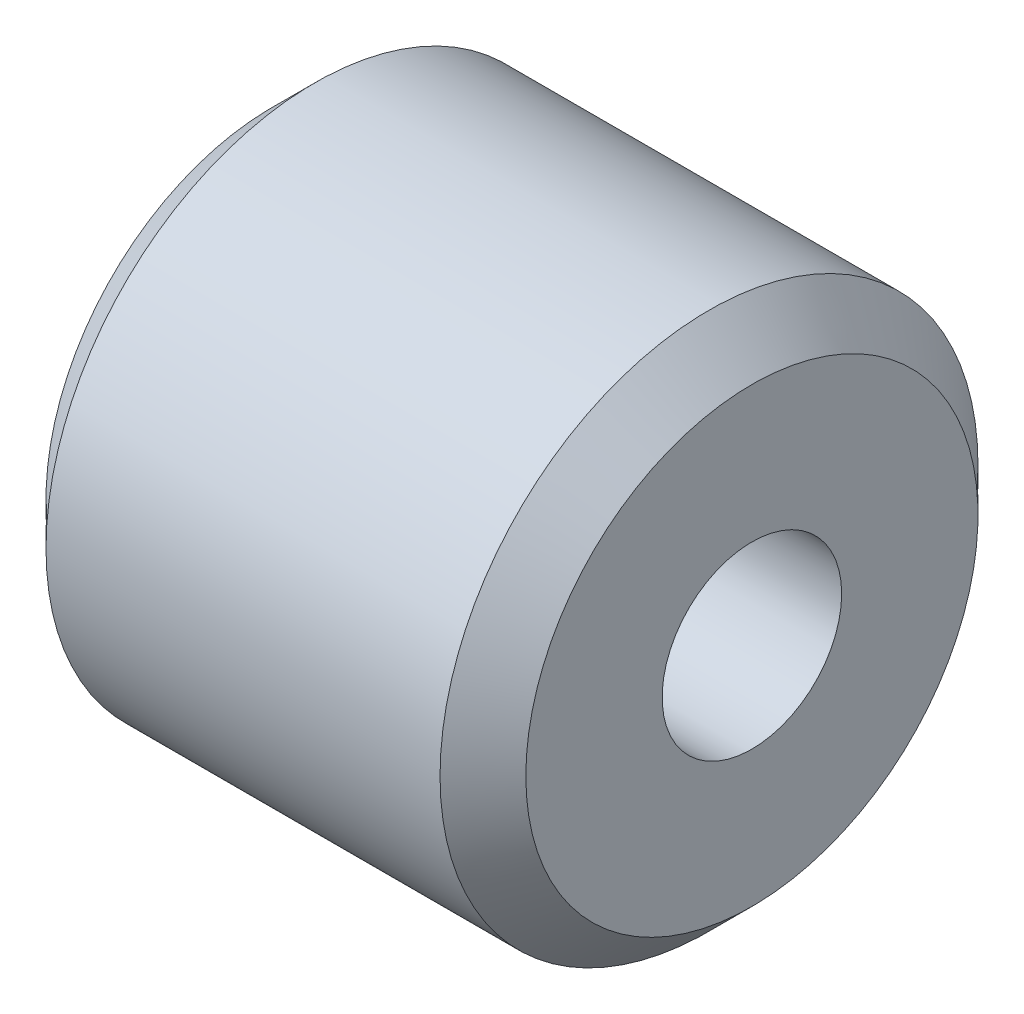
ISO-10303-21;
HEADER;
FILE_DESCRIPTION(('STEP AP214'),'2;1');
FILE_NAME('part.step','',(''),(''),'','','');
FILE_SCHEMA(('AUTOMOTIVE_DESIGN { 1 0 10303 214 1 1 1 1 }'));
ENDSEC;
DATA;
#1=APPLICATION_CONTEXT('core data for automotive mechanical design processes');
#2=APPLICATION_PROTOCOL_DEFINITION('international standard','automotive_design',2000,#1);
#3=PRODUCT_CONTEXT('',#1,'mechanical');
#4=PRODUCT('Part','Part','',(#3));
#5=PRODUCT_RELATED_PRODUCT_CATEGORY('part','',(#4));
#6=PRODUCT_DEFINITION_FORMATION('','',#4);
#7=PRODUCT_DEFINITION_CONTEXT('part definition',#1,'design');
#8=PRODUCT_DEFINITION('design','',#6,#7);
#9=PRODUCT_DEFINITION_SHAPE('','',#8);
#10=(LENGTH_UNIT() NAMED_UNIT(*) SI_UNIT(.MILLI.,.METRE.));
#11=(NAMED_UNIT(*) PLANE_ANGLE_UNIT() SI_UNIT($,.RADIAN.));
#12=(NAMED_UNIT(*) SI_UNIT($,.STERADIAN.) SOLID_ANGLE_UNIT());
#13=UNCERTAINTY_MEASURE_WITH_UNIT(LENGTH_MEASURE(1.E-05),#10,'distance_accuracy_value','');
#14=(GEOMETRIC_REPRESENTATION_CONTEXT(3) GLOBAL_UNCERTAINTY_ASSIGNED_CONTEXT((#13)) GLOBAL_UNIT_ASSIGNED_CONTEXT((#10,
#11,#12)) REPRESENTATION_CONTEXT('',''));
#15=CARTESIAN_POINT('',(0.,0.,0.));
#16=DIRECTION('',(0.,0.,1.));
#17=DIRECTION('',(1.,0.,0.));
#18=AXIS2_PLACEMENT_3D('',#15,#16,#17);
#19=CARTESIAN_POINT('',(4.25,0.,0.));
#20=DIRECTION('',(1.,0.,0.));
#21=DIRECTION('',(0.,0.,-1.));
#22=AXIS2_PLACEMENT_3D('',#19,#20,#21);
#23=PLANE('',#22);
#24=CARTESIAN_POINT('',(4.25,0.,0.));
#25=DIRECTION('',(1.,0.,0.));
#26=DIRECTION('',(0.,0.,-1.));
#27=AXIS2_PLACEMENT_3D('',#24,#25,#26);
#28=CIRCLE('',#27,4.005);
#29=CARTESIAN_POINT('',(4.25,0.,4.005));
#30=VERTEX_POINT('',#29);
#31=EDGE_CURVE('E49',#30,#30,#28,.T.);
#32=ORIENTED_EDGE('',*,*,#31,.T.);
#33=EDGE_LOOP('',(#32));
#34=FACE_BOUND('',#33,.T.);
#35=CARTESIAN_POINT('',(4.25,0.,0.));
#36=DIRECTION('',(1.,0.,0.));
#37=DIRECTION('',(0.,0.,-1.));
#38=AXIS2_PLACEMENT_3D('',#35,#36,#37);
#39=CIRCLE('',#38,1.59);
#40=CARTESIAN_POINT('',(4.25,0.,-1.59));
#41=VERTEX_POINT('',#40);
#42=EDGE_CURVE('E54',#41,#41,#39,.T.);
#43=ORIENTED_EDGE('',*,*,#42,.F.);
#44=EDGE_LOOP('',(#43));
#45=FACE_BOUND('',#44,.T.);
#46=ADVANCED_FACE('F33',(#34,#45),#23,.T.);
#47=CARTESIAN_POINT('',(-4.25,0.,0.));
#48=DIRECTION('',(1.,0.,0.));
#49=DIRECTION('',(0.,0.,-1.));
#50=AXIS2_PLACEMENT_3D('',#47,#48,#49);
#51=PLANE('',#50);
#52=CARTESIAN_POINT('',(-4.25,0.,0.));
#53=DIRECTION('',(1.,0.,0.));
#54=DIRECTION('',(0.,0.,-1.));
#55=AXIS2_PLACEMENT_3D('',#52,#53,#54);
#56=CIRCLE('',#55,4.00499999999999);
#57=CARTESIAN_POINT('',(-4.25,0.,-4.00499999999999));
#58=VERTEX_POINT('',#57);
#59=EDGE_CURVE('E10',#58,#58,#56,.F.);
#60=ORIENTED_EDGE('',*,*,#59,.T.);
#61=EDGE_LOOP('',(#60));
#62=FACE_BOUND('',#61,.T.);
#63=CARTESIAN_POINT('',(-4.25,0.,0.));
#64=DIRECTION('',(1.,0.,0.));
#65=DIRECTION('',(0.,0.,-1.));
#66=AXIS2_PLACEMENT_3D('',#63,#64,#65);
#67=CIRCLE('',#66,1.59);
#68=CARTESIAN_POINT('',(-4.25,0.,-1.59));
#69=VERTEX_POINT('',#68);
#70=EDGE_CURVE('E55',#69,#69,#67,.T.);
#71=ORIENTED_EDGE('',*,*,#70,.T.);
#72=EDGE_LOOP('',(#71));
#73=FACE_BOUND('',#72,.T.);
#74=ADVANCED_FACE('F65',(#62,#73),#51,.F.);
#75=CARTESIAN_POINT('',(4.25,0.,0.));
#76=DIRECTION('',(-1.,0.,0.));
#77=DIRECTION('',(0.,0.,1.));
#78=AXIS2_PLACEMENT_3D('',#75,#76,#77);
#79=CYLINDRICAL_SURFACE('',#78,4.765);
#80=CARTESIAN_POINT('',(3.49,0.,0.));
#81=DIRECTION('',(1.,0.,0.));
#82=DIRECTION('',(0.,0.,-1.));
#83=AXIS2_PLACEMENT_3D('',#80,#81,#82);
#84=CIRCLE('',#83,4.765);
#85=CARTESIAN_POINT('',(3.49,0.,4.765));
#86=VERTEX_POINT('',#85);
#87=EDGE_CURVE('E41',#86,#86,#84,.F.);
#88=CARTESIAN_POINT('',(-3.49,0.,0.));
#89=DIRECTION('',(1.,0.,0.));
#90=DIRECTION('',(0.,0.,-1.));
#91=AXIS2_PLACEMENT_3D('',#88,#89,#90);
#92=CIRCLE('',#91,4.765);
#93=CARTESIAN_POINT('',(-3.49,0.,4.765));
#94=VERTEX_POINT('',#93);
#95=EDGE_CURVE('E45',#94,#94,#92,.T.);
#96=CARTESIAN_POINT('',(3.49,0.,4.765));
#97=CARTESIAN_POINT('',(3.41729166666666,0.,4.765));
#98=CARTESIAN_POINT('',(3.34458333333333,0.,4.765));
#99=CARTESIAN_POINT('',(3.19916666666666,0.,4.765));
#100=CARTESIAN_POINT('',(3.12645833333333,0.,4.765));
#101=CARTESIAN_POINT('',(2.98104166666666,0.,4.765));
#102=CARTESIAN_POINT('',(2.90833333333333,0.,4.765));
#103=CARTESIAN_POINT('',(2.76291666666666,0.,4.765));
#104=CARTESIAN_POINT('',(2.69020833333333,0.,4.765));
#105=CARTESIAN_POINT('',(2.54479166666667,0.,4.765));
#106=CARTESIAN_POINT('',(2.47208333333333,0.,4.765));
#107=CARTESIAN_POINT('',(2.32666666666667,0.,4.765));
#108=CARTESIAN_POINT('',(2.25395833333333,0.,4.765));
#109=CARTESIAN_POINT('',(2.10854166666667,0.,4.765));
#110=CARTESIAN_POINT('',(2.03583333333333,0.,4.765));
#111=CARTESIAN_POINT('',(1.89041666666667,0.,4.765));
#112=CARTESIAN_POINT('',(1.81770833333333,0.,4.765));
#113=CARTESIAN_POINT('',(1.67229166666667,0.,4.765));
#114=CARTESIAN_POINT('',(1.59958333333333,0.,4.765));
#115=CARTESIAN_POINT('',(1.45416666666667,0.,4.765));
#116=CARTESIAN_POINT('',(1.38145833333333,0.,4.765));
#117=CARTESIAN_POINT('',(1.23604166666667,0.,4.765));
#118=CARTESIAN_POINT('',(1.16333333333333,0.,4.765));
#119=CARTESIAN_POINT('',(1.01791666666667,0.,4.765));
#120=CARTESIAN_POINT('',(0.945208333333333,0.,4.765));
#121=CARTESIAN_POINT('',(0.799791666666666,0.,4.765));
#122=CARTESIAN_POINT('',(0.727083333333333,0.,4.765));
#123=CARTESIAN_POINT('',(0.581666666666666,0.,4.765));
#124=CARTESIAN_POINT('',(0.508958333333333,0.,4.765));
#125=CARTESIAN_POINT('',(0.363541666666667,0.,4.765));
#126=CARTESIAN_POINT('',(0.290833333333333,0.,4.765));
#127=CARTESIAN_POINT('',(0.145416666666666,0.,4.765));
#128=CARTESIAN_POINT('',(0.0727083333333332,0.,4.765));
#129=CARTESIAN_POINT('',(-0.0727083333333335,0.,4.765));
#130=CARTESIAN_POINT('',(-0.145416666666667,0.,4.765));
#131=CARTESIAN_POINT('',(-0.290833333333334,0.,4.765));
#132=CARTESIAN_POINT('',(-0.363541666666667,0.,4.765));
#133=CARTESIAN_POINT('',(-0.508958333333333,0.,4.765));
#134=CARTESIAN_POINT('',(-0.581666666666666,0.,4.765));
#135=CARTESIAN_POINT('',(-0.727083333333333,0.,4.765));
#136=CARTESIAN_POINT('',(-0.799791666666667,0.,4.765));
#137=CARTESIAN_POINT('',(-0.945208333333333,0.,4.765));
#138=CARTESIAN_POINT('',(-1.01791666666667,0.,4.765));
#139=CARTESIAN_POINT('',(-1.16333333333333,0.,4.765));
#140=CARTESIAN_POINT('',(-1.23604166666667,0.,4.765));
#141=CARTESIAN_POINT('',(-1.38145833333333,0.,4.765));
#142=CARTESIAN_POINT('',(-1.45416666666667,0.,4.765));
#143=CARTESIAN_POINT('',(-1.59958333333333,0.,4.765));
#144=CARTESIAN_POINT('',(-1.67229166666667,0.,4.765));
#145=CARTESIAN_POINT('',(-1.81770833333333,0.,4.765));
#146=CARTESIAN_POINT('',(-1.89041666666667,0.,4.765));
#147=CARTESIAN_POINT('',(-2.03583333333333,0.,4.765));
#148=CARTESIAN_POINT('',(-2.10854166666667,0.,4.765));
#149=CARTESIAN_POINT('',(-2.25395833333333,0.,4.765));
#150=CARTESIAN_POINT('',(-2.32666666666667,0.,4.765));
#151=CARTESIAN_POINT('',(-2.47208333333333,0.,4.765));
#152=CARTESIAN_POINT('',(-2.54479166666667,0.,4.765));
#153=CARTESIAN_POINT('',(-2.69020833333333,0.,4.765));
#154=CARTESIAN_POINT('',(-2.76291666666667,0.,4.765));
#155=CARTESIAN_POINT('',(-2.90833333333333,0.,4.765));
#156=CARTESIAN_POINT('',(-2.98104166666667,0.,4.765));
#157=CARTESIAN_POINT('',(-3.12645833333333,0.,4.765));
#158=CARTESIAN_POINT('',(-3.19916666666667,0.,4.765));
#159=CARTESIAN_POINT('',(-3.34458333333333,0.,4.765));
#160=CARTESIAN_POINT('',(-3.41729166666667,0.,4.765));
#161=CARTESIAN_POINT('',(-3.49,0.,4.765));
#162=B_SPLINE_CURVE_WITH_KNOTS('',3,(#96,#97,#98,#99,#100,#101,#102,#103,#104,#105,#106,#107,
#108,#109,#110,#111,#112,#113,#114,#115,#116,#117,#118,#119,#120,#121,#122,#123,#124,#125,#126,
#127,#128,#129,#130,#131,#132,#133,#134,#135,#136,#137,#138,#139,#140,#141,#142,#143,#144,#145,
#146,#147,#148,#149,#150,#151,#152,#153,#154,#155,#156,#157,#158,#159,#160,#161),.UNSPECIFIED.,
.F.,.F.,(4,2,2,2,2,2,2,2,2,2,2,2,2,2,2,2,2,2,2,2,2,2,2,2,2,2,2,2,2,2,2,2,4),(0.,0.218125,
0.43625,0.654375,0.8725,1.090625,1.30875,1.526875,1.745,1.963125,2.18125,2.399375,2.6175,
2.835625,3.05375,3.271875,3.49,3.708125,3.92625,4.144375,4.3625,4.580625,4.79875,5.016875,5.235,
5.453125,5.67125,5.889375,6.1075,6.325625,6.54375,6.761875,6.98),.UNSPECIFIED.);
#163=EDGE_CURVE('BSEAM71',#86,#94,#162,.T.);
#164=ORIENTED_EDGE('',*,*,#87,.T.);
#165=ORIENTED_EDGE('',*,*,#95,.T.);
#166=ORIENTED_EDGE('',*,*,#163,.T.);
#167=ORIENTED_EDGE('',*,*,#163,.F.);
#168=EDGE_LOOP('',(#164,#166,#165,#167));
#169=FACE_BOUND('',#168,.T.);
#170=ADVANCED_FACE('F71',(#169),#79,.T.);
#171=CARTESIAN_POINT('',(4.25,0.,0.));
#172=DIRECTION('',(-1.,0.,0.));
#173=DIRECTION('',(0.,0.,1.));
#174=AXIS2_PLACEMENT_3D('',#171,#172,#173);
#175=CYLINDRICAL_SURFACE('',#174,1.59);
#176=ORIENTED_EDGE('',*,*,#42,.T.);
#177=EDGE_LOOP('',(#176));
#178=FACE_BOUND('',#177,.T.);
#179=ORIENTED_EDGE('',*,*,#70,.F.);
#180=EDGE_LOOP('',(#179));
#181=FACE_BOUND('',#180,.T.);
#182=ADVANCED_FACE('F61',(#178,#181),#175,.F.);
#183=CARTESIAN_POINT('',(4.25,0.,0.));
#184=DIRECTION('',(-1.,0.,0.));
#185=DIRECTION('',(0.,0.,1.));
#186=AXIS2_PLACEMENT_3D('',#183,#184,#185);
#187=CONICAL_SURFACE('',#186,4.005,0.785398163397447);
#188=CARTESIAN_POINT('',(3.49,0.,4.765));
#189=CARTESIAN_POINT('',(3.49791666666667,0.,4.75708333333333));
#190=CARTESIAN_POINT('',(3.50583333333333,0.,4.74916666666667));
#191=CARTESIAN_POINT('',(3.52166666666666,0.,4.73333333333333));
#192=CARTESIAN_POINT('',(3.52958333333333,0.,4.72541666666667));
#193=CARTESIAN_POINT('',(3.54541666666666,0.,4.70958333333333));
#194=CARTESIAN_POINT('',(3.55333333333333,0.,4.70166666666667));
#195=CARTESIAN_POINT('',(3.56916666666667,0.,4.68583333333333));
#196=CARTESIAN_POINT('',(3.57708333333333,0.,4.67791666666667));
#197=CARTESIAN_POINT('',(3.59291666666666,0.,4.66208333333333));
#198=CARTESIAN_POINT('',(3.60083333333333,0.,4.65416666666667));
#199=CARTESIAN_POINT('',(3.61666666666666,0.,4.63833333333333));
#200=CARTESIAN_POINT('',(3.62458333333333,0.,4.63041666666667));
#201=CARTESIAN_POINT('',(3.64041666666667,0.,4.61458333333333));
#202=CARTESIAN_POINT('',(3.64833333333333,0.,4.60666666666667));
#203=CARTESIAN_POINT('',(3.66416666666666,0.,4.59083333333333));
#204=CARTESIAN_POINT('',(3.67208333333333,0.,4.58291666666667));
#205=CARTESIAN_POINT('',(3.68791666666667,0.,4.56708333333333));
#206=CARTESIAN_POINT('',(3.69583333333333,0.,4.55916666666667));
#207=CARTESIAN_POINT('',(3.71166666666667,0.,4.54333333333333));
#208=CARTESIAN_POINT('',(3.71958333333333,0.,4.53541666666667));
#209=CARTESIAN_POINT('',(3.73541666666667,0.,4.51958333333333));
#210=CARTESIAN_POINT('',(3.74333333333333,0.,4.51166666666667));
#211=CARTESIAN_POINT('',(3.75916666666666,0.,4.49583333333333));
#212=CARTESIAN_POINT('',(3.76708333333333,0.,4.48791666666667));
#213=CARTESIAN_POINT('',(3.78291666666667,0.,4.47208333333333));
#214=CARTESIAN_POINT('',(3.79083333333333,0.,4.46416666666667));
#215=CARTESIAN_POINT('',(3.80666666666667,0.,4.44833333333333));
#216=CARTESIAN_POINT('',(3.81458333333333,0.,4.44041666666667));
#217=CARTESIAN_POINT('',(3.83041666666667,0.,4.42458333333333));
#218=CARTESIAN_POINT('',(3.83833333333333,0.,4.41666666666667));
#219=CARTESIAN_POINT('',(3.85416666666667,0.,4.40083333333333));
#220=CARTESIAN_POINT('',(3.86208333333333,0.,4.39291666666667));
#221=CARTESIAN_POINT('',(3.87791666666667,0.,4.37708333333333));
#222=CARTESIAN_POINT('',(3.88583333333333,0.,4.36916666666667));
#223=CARTESIAN_POINT('',(3.90166666666667,0.,4.35333333333333));
#224=CARTESIAN_POINT('',(3.90958333333333,0.,4.34541666666667));
#225=CARTESIAN_POINT('',(3.92541666666667,0.,4.32958333333333));
#226=CARTESIAN_POINT('',(3.93333333333333,0.,4.32166666666667));
#227=CARTESIAN_POINT('',(3.94916666666667,0.,4.30583333333333));
#228=CARTESIAN_POINT('',(3.95708333333333,0.,4.29791666666667));
#229=CARTESIAN_POINT('',(3.97291666666667,0.,4.28208333333333));
#230=CARTESIAN_POINT('',(3.98083333333333,0.,4.27416666666667));
#231=CARTESIAN_POINT('',(3.99666666666667,0.,4.25833333333333));
#232=CARTESIAN_POINT('',(4.00458333333333,0.,4.25041666666667));
#233=CARTESIAN_POINT('',(4.02041666666667,0.,4.23458333333333));
#234=CARTESIAN_POINT('',(4.02833333333333,0.,4.22666666666667));
#235=CARTESIAN_POINT('',(4.04416666666667,0.,4.21083333333333));
#236=CARTESIAN_POINT('',(4.05208333333333,0.,4.20291666666667));
#237=CARTESIAN_POINT('',(4.06791666666667,0.,4.18708333333333));
#238=CARTESIAN_POINT('',(4.07583333333333,0.,4.17916666666667));
#239=CARTESIAN_POINT('',(4.09166666666667,0.,4.16333333333333));
#240=CARTESIAN_POINT('',(4.09958333333333,0.,4.15541666666667));
#241=CARTESIAN_POINT('',(4.11541666666667,0.,4.13958333333333));
#242=CARTESIAN_POINT('',(4.12333333333333,0.,4.13166666666667));
#243=CARTESIAN_POINT('',(4.13916666666667,0.,4.11583333333333));
#244=CARTESIAN_POINT('',(4.14708333333333,0.,4.10791666666667));
#245=CARTESIAN_POINT('',(4.16291666666667,0.,4.09208333333333));
#246=CARTESIAN_POINT('',(4.17083333333333,0.,4.08416666666667));
#247=CARTESIAN_POINT('',(4.18666666666667,0.,4.06833333333333));
#248=CARTESIAN_POINT('',(4.19458333333333,0.,4.06041666666667));
#249=CARTESIAN_POINT('',(4.21041666666667,0.,4.04458333333333));
#250=CARTESIAN_POINT('',(4.21833333333333,0.,4.03666666666667));
#251=CARTESIAN_POINT('',(4.23416666666667,0.,4.02083333333333));
#252=CARTESIAN_POINT('',(4.24208333333333,0.,4.01291666666667));
#253=CARTESIAN_POINT('',(4.25,0.,4.005));
#254=B_SPLINE_CURVE_WITH_KNOTS('',3,(#188,#189,#190,#191,#192,#193,#194,#195,#196,#197,#198,
#199,#200,#201,#202,#203,#204,#205,#206,#207,#208,#209,#210,#211,#212,#213,#214,#215,#216,#217,
#218,#219,#220,#221,#222,#223,#224,#225,#226,#227,#228,#229,#230,#231,#232,#233,#234,#235,#236,
#237,#238,#239,#240,#241,#242,#243,#244,#245,#246,#247,#248,#249,#250,#251,#252,#253),
.UNSPECIFIED.,.F.,.F.,(4,2,2,2,2,2,2,2,2,2,2,2,2,2,2,2,2,2,2,2,2,2,2,2,2,2,2,2,2,2,2,2,4),(0.,
0.0335875721063615,0.0671751442127227,0.100762716319083,0.134350288425445,0.167937860531806,
0.201525432638167,0.235113004744528,0.268700576850888,0.30228814895725,0.335875721063611,
0.369463293169972,0.403050865276333,0.436638437382694,0.470226009489055,0.503813581595416,
0.537401153701777,0.570988725808138,0.604576297914499,0.63816387002086,0.671751442127221,
0.705339014233582,0.738926586339944,0.772514158446304,0.806101730552666,0.839689302659026,
0.873276874765387,0.906864446871748,0.940452018978109,0.974039591084471,1.00762716319083,
1.04121473529719,1.07480230740355),.UNSPECIFIED.);
#255=EDGE_CURVE('BSEAM77',#86,#30,#254,.T.);
#256=ORIENTED_EDGE('',*,*,#87,.F.);
#257=ORIENTED_EDGE('',*,*,#31,.F.);
#258=ORIENTED_EDGE('',*,*,#255,.T.);
#259=ORIENTED_EDGE('',*,*,#255,.F.);
#260=EDGE_LOOP('',(#256,#258,#257,#259));
#261=FACE_BOUND('',#260,.T.);
#262=ADVANCED_FACE('F77',(#261),#187,.T.);
#263=CARTESIAN_POINT('',(-3.49,0.,0.));
#264=DIRECTION('',(1.,0.,0.));
#265=DIRECTION('',(0.,0.,-1.));
#266=AXIS2_PLACEMENT_3D('',#263,#264,#265);
#267=CONICAL_SURFACE('',#266,4.765,0.785398163397451);
#268=ORIENTED_EDGE('',*,*,#59,.F.);
#269=EDGE_LOOP('',(#268));
#270=FACE_BOUND('',#269,.T.);
#271=ORIENTED_EDGE('',*,*,#95,.F.);
#272=EDGE_LOOP('',(#271));
#273=FACE_BOUND('',#272,.T.);
#274=ADVANCED_FACE('F36',(#270,#273),#267,.T.);
#275=CLOSED_SHELL('',(#46,#74,#170,#182,#262,#274));
#276=MANIFOLD_SOLID_BREP('B2',#275);
#277=ADVANCED_BREP_SHAPE_REPRESENTATION('',(#18,#276),#14);
#278=SHAPE_DEFINITION_REPRESENTATION(#9,#277);
ENDSEC;
END-ISO-10303-21;
